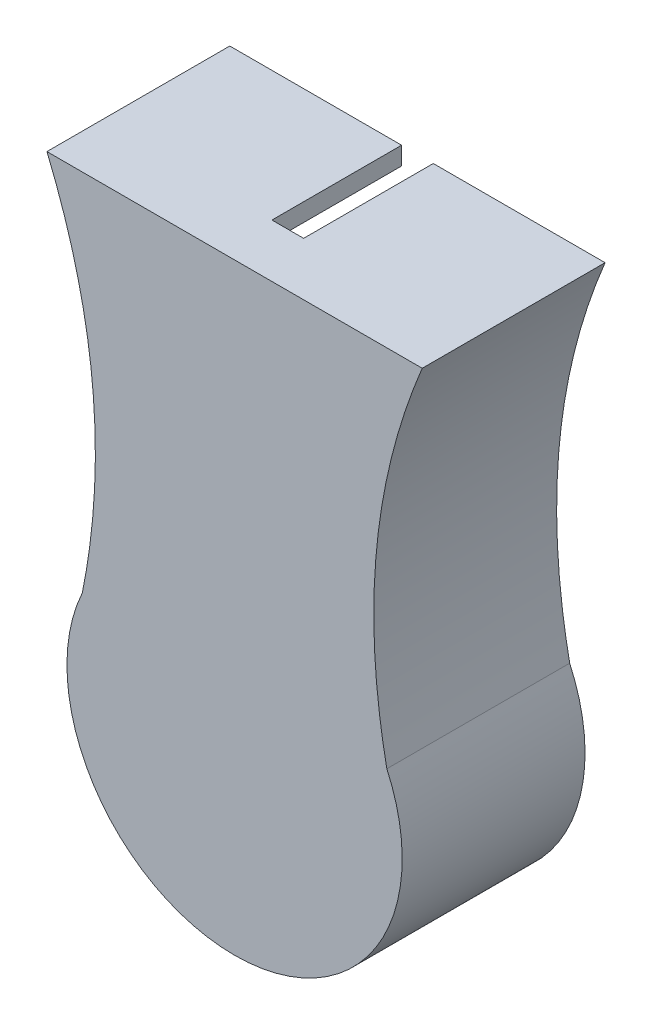
ISO-10303-21;
HEADER;
FILE_DESCRIPTION(('STEP AP214'),'2;1');
FILE_NAME('part.step','',(''),(''),'','','');
FILE_SCHEMA(('AUTOMOTIVE_DESIGN { 1 0 10303 214 1 1 1 1 }'));
ENDSEC;
DATA;
#1=APPLICATION_CONTEXT('core data for automotive mechanical design processes');
#2=APPLICATION_PROTOCOL_DEFINITION('international standard','automotive_design',2000,#1);
#3=PRODUCT_CONTEXT('',#1,'mechanical');
#4=PRODUCT('Part','Part','',(#3));
#5=PRODUCT_RELATED_PRODUCT_CATEGORY('part','',(#4));
#6=PRODUCT_DEFINITION_FORMATION('','',#4);
#7=PRODUCT_DEFINITION_CONTEXT('part definition',#1,'design');
#8=PRODUCT_DEFINITION('design','',#6,#7);
#9=PRODUCT_DEFINITION_SHAPE('','',#8);
#10=(LENGTH_UNIT() NAMED_UNIT(*) SI_UNIT(.MILLI.,.METRE.));
#11=(NAMED_UNIT(*) PLANE_ANGLE_UNIT() SI_UNIT($,.RADIAN.));
#12=(NAMED_UNIT(*) SI_UNIT($,.STERADIAN.) SOLID_ANGLE_UNIT());
#13=UNCERTAINTY_MEASURE_WITH_UNIT(LENGTH_MEASURE(1.E-05),#10,'distance_accuracy_value','');
#14=(GEOMETRIC_REPRESENTATION_CONTEXT(3) GLOBAL_UNCERTAINTY_ASSIGNED_CONTEXT((#13)) GLOBAL_UNIT_ASSIGNED_CONTEXT((#10,
#11,#12)) REPRESENTATION_CONTEXT('',''));
#15=CARTESIAN_POINT('',(0.,0.,0.));
#16=DIRECTION('',(0.,0.,1.));
#17=DIRECTION('',(1.,0.,0.));
#18=AXIS2_PLACEMENT_3D('',#15,#16,#17);
#19=CARTESIAN_POINT('',(30.7872849939756,71.3076466668099,30.));
#20=CARTESIAN_POINT('',(18.7115178403524,42.368167262495,30.));
#21=CARTESIAN_POINT('',(24.9829968324256,11.4934707234591,30.));
#22=B_SPLINE_CURVE_WITH_KNOTS('',2,(#19,#20,#21),.UNSPECIFIED.,.F.,.F.,(3,3),(0.,1.),.UNSPECIFIED.);
#23=DIRECTION('',(0.,0.,-1.));
#24=VECTOR('',#23,1.);
#25=SURFACE_OF_LINEAR_EXTRUSION('',#22,#24);
#26=CARTESIAN_POINT('',(30.7872849939756,71.3076466668099,0.));
#27=CARTESIAN_POINT('',(18.7115178403524,42.368167262495,0.));
#28=CARTESIAN_POINT('',(24.9829968324256,11.4934707234591,0.));
#29=B_SPLINE_CURVE_WITH_KNOTS('',2,(#26,#27,#28),.UNSPECIFIED.,.F.,.F.,(3,3),(0.,1.),.UNSPECIFIED.);
#30=CARTESIAN_POINT('',(30.7872849939756,71.3076466668099,0.));
#31=VERTEX_POINT('',#30);
#32=CARTESIAN_POINT('',(24.9829968324256,11.4934707234591,0.));
#33=VERTEX_POINT('',#32);
#34=EDGE_CURVE('E259',#31,#33,#29,.T.);
#35=ORIENTED_EDGE('',*,*,#34,.F.);
#36=DIRECTION('',(0.,0.,-1.));
#37=VECTOR('',#36,1.);
#38=CARTESIAN_POINT('',(30.7872849939756,71.3076466668099,30.));
#39=LINE('',#38,#37);
#40=CARTESIAN_POINT('',(30.7872849939756,71.3076466668099,30.));
#41=VERTEX_POINT('',#40);
#42=EDGE_CURVE('E12',#41,#31,#39,.T.);
#43=ORIENTED_EDGE('',*,*,#42,.F.);
#44=CARTESIAN_POINT('',(24.9829968324256,11.4934707234591,30.));
#45=VERTEX_POINT('',#44);
#46=EDGE_CURVE('E265',#41,#45,#22,.T.);
#47=ORIENTED_EDGE('',*,*,#46,.T.);
#48=DIRECTION('',(0.,0.,-1.));
#49=VECTOR('',#48,1.);
#50=CARTESIAN_POINT('',(24.9829968324256,11.4934707234591,30.));
#51=LINE('',#50,#49);
#52=EDGE_CURVE('E123',#45,#33,#51,.T.);
#53=ORIENTED_EDGE('',*,*,#52,.T.);
#54=EDGE_LOOP('',(#35,#43,#47,#53));
#55=FACE_BOUND('',#54,.T.);
#56=ADVANCED_FACE('F77',(#55),#25,.T.);
#57=CARTESIAN_POINT('',(0.,71.3076466668099,30.));
#58=DIRECTION('',(0.,1.,0.));
#59=DIRECTION('',(0.,0.,1.));
#60=AXIS2_PLACEMENT_3D('',#57,#58,#59);
#61=PLANE('',#60);
#62=DIRECTION('',(0.,0.,-1.));
#63=VECTOR('',#62,1.);
#64=CARTESIAN_POINT('',(-2.6,71.3076466668099,21.27));
#65=LINE('',#64,#63);
#66=CARTESIAN_POINT('',(-2.6,71.3076466668099,21.27));
#67=VERTEX_POINT('',#66);
#68=CARTESIAN_POINT('',(-2.6,71.3076466668099,0.));
#69=VERTEX_POINT('',#68);
#70=EDGE_CURVE('E251',#67,#69,#65,.T.);
#71=ORIENTED_EDGE('',*,*,#70,.T.);
#72=DIRECTION('',(1.,0.,0.));
#73=VECTOR('',#72,1.);
#74=CARTESIAN_POINT('',(0.,71.3076466668099,0.));
#75=LINE('',#74,#73);
#76=CARTESIAN_POINT('',(-30.7872849939756,71.3076466668099,0.));
#77=VERTEX_POINT('',#76);
#78=EDGE_CURVE('E304',#77,#69,#75,.T.);
#79=ORIENTED_EDGE('',*,*,#78,.F.);
#80=DIRECTION('',(0.,0.,-1.));
#81=VECTOR('',#80,1.);
#82=CARTESIAN_POINT('',(-30.7872849939756,71.3076466668099,30.));
#83=LINE('',#82,#81);
#84=CARTESIAN_POINT('',(-30.7872849939756,71.3076466668099,30.));
#85=VERTEX_POINT('',#84);
#86=EDGE_CURVE('E86',#85,#77,#83,.T.);
#87=ORIENTED_EDGE('',*,*,#86,.F.);
#88=DIRECTION('',(1.,0.,0.));
#89=VECTOR('',#88,1.);
#90=CARTESIAN_POINT('',(0.,71.3076466668099,30.));
#91=LINE('',#90,#89);
#92=EDGE_CURVE('E271',#85,#41,#91,.T.);
#93=ORIENTED_EDGE('',*,*,#92,.T.);
#94=ORIENTED_EDGE('',*,*,#42,.T.);
#95=CARTESIAN_POINT('',(2.6,71.3076466668099,0.));
#96=VERTEX_POINT('',#95);
#97=EDGE_CURVE('E316',#96,#31,#75,.T.);
#98=ORIENTED_EDGE('',*,*,#97,.F.);
#99=DIRECTION('',(0.,0.,-1.));
#100=VECTOR('',#99,1.);
#101=CARTESIAN_POINT('',(2.6,71.3076466668099,21.27));
#102=LINE('',#101,#100);
#103=CARTESIAN_POINT('',(2.6,71.3076466668099,21.27));
#104=VERTEX_POINT('',#103);
#105=EDGE_CURVE('E93',#104,#96,#102,.T.);
#106=ORIENTED_EDGE('',*,*,#105,.F.);
#107=DIRECTION('',(-1.,0.,0.));
#108=VECTOR('',#107,1.);
#109=CARTESIAN_POINT('',(2.6,71.3076466668099,21.27));
#110=LINE('',#109,#108);
#111=EDGE_CURVE('E243',#104,#67,#110,.T.);
#112=ORIENTED_EDGE('',*,*,#111,.T.);
#113=EDGE_LOOP('',(#71,#79,#87,#93,#94,#98,#106,#112));
#114=FACE_BOUND('',#113,.T.);
#115=ADVANCED_FACE('F294',(#114),#61,.T.);
#116=CARTESIAN_POINT('',(-30.7872849939756,71.3076466668099,30.));
#117=CARTESIAN_POINT('',(-18.7115178403524,42.368167262495,30.));
#118=CARTESIAN_POINT('',(-24.9829968324256,11.4934707234591,30.));
#119=B_SPLINE_CURVE_WITH_KNOTS('',2,(#116,#117,#118),.UNSPECIFIED.,.F.,.F.,(3,3),(0.,1.),.UNSPECIFIED.);
#120=DIRECTION('',(0.,0.,-1.));
#121=VECTOR('',#120,1.);
#122=SURFACE_OF_LINEAR_EXTRUSION('',#119,#121);
#123=CARTESIAN_POINT('',(-30.7872849939756,71.3076466668099,0.));
#124=CARTESIAN_POINT('',(-18.7115178403524,42.368167262495,0.));
#125=CARTESIAN_POINT('',(-24.9829968324256,11.4934707234591,0.));
#126=B_SPLINE_CURVE_WITH_KNOTS('',2,(#123,#124,#125),.UNSPECIFIED.,.F.,.F.,(3,3),(0.,1.),.UNSPECIFIED.);
#127=CARTESIAN_POINT('',(-24.9829968324256,11.4934707234591,0.));
#128=VERTEX_POINT('',#127);
#129=EDGE_CURVE('E314',#77,#128,#126,.T.);
#130=ORIENTED_EDGE('',*,*,#129,.T.);
#131=DIRECTION('',(0.,0.,-1.));
#132=VECTOR('',#131,1.);
#133=CARTESIAN_POINT('',(-24.9829968324256,11.4934707234591,30.));
#134=LINE('',#133,#132);
#135=CARTESIAN_POINT('',(-24.9829968324256,11.4934707234591,30.));
#136=VERTEX_POINT('',#135);
#137=EDGE_CURVE('E333',#136,#128,#134,.T.);
#138=ORIENTED_EDGE('',*,*,#137,.F.);
#139=EDGE_CURVE('E279',#85,#136,#119,.T.);
#140=ORIENTED_EDGE('',*,*,#139,.F.);
#141=ORIENTED_EDGE('',*,*,#86,.T.);
#142=EDGE_LOOP('',(#130,#138,#140,#141));
#143=FACE_BOUND('',#142,.T.);
#144=ADVANCED_FACE('F290',(#143),#122,.F.);
#145=CARTESIAN_POINT('',(0.,0.,30.));
#146=DIRECTION('',(0.,0.,-1.));
#147=DIRECTION('',(-1.,0.,0.));
#148=AXIS2_PLACEMENT_3D('',#145,#146,#147);
#149=CYLINDRICAL_SURFACE('',#148,27.5);
#150=CARTESIAN_POINT('',(0.,0.,0.));
#151=DIRECTION('',(0.,0.,1.));
#152=DIRECTION('',(1.,0.,0.));
#153=AXIS2_PLACEMENT_3D('',#150,#151,#152);
#154=CIRCLE('',#153,27.5);
#155=EDGE_CURVE('E272',#128,#33,#154,.T.);
#156=ORIENTED_EDGE('',*,*,#155,.T.);
#157=ORIENTED_EDGE('',*,*,#52,.F.);
#158=CARTESIAN_POINT('',(0.,0.,30.));
#159=DIRECTION('',(0.,0.,1.));
#160=DIRECTION('',(1.,0.,0.));
#161=AXIS2_PLACEMENT_3D('',#158,#159,#160);
#162=CIRCLE('',#161,27.5);
#163=EDGE_CURVE('E102',#136,#45,#162,.T.);
#164=ORIENTED_EDGE('',*,*,#163,.F.);
#165=ORIENTED_EDGE('',*,*,#137,.T.);
#166=EDGE_LOOP('',(#156,#157,#164,#165));
#167=FACE_BOUND('',#166,.T.);
#168=ADVANCED_FACE('F293',(#167),#149,.T.);
#169=CARTESIAN_POINT('',(0.,0.,30.));
#170=DIRECTION('',(0.,0.,1.));
#171=DIRECTION('',(1.,0.,0.));
#172=AXIS2_PLACEMENT_3D('',#169,#170,#171);
#173=PLANE('',#172);
#174=ORIENTED_EDGE('',*,*,#46,.F.);
#175=ORIENTED_EDGE('',*,*,#92,.F.);
#176=ORIENTED_EDGE('',*,*,#139,.T.);
#177=ORIENTED_EDGE('',*,*,#163,.T.);
#178=EDGE_LOOP('',(#174,#175,#176,#177));
#179=FACE_BOUND('',#178,.T.);
#180=ADVANCED_FACE('F341',(#179),#173,.T.);
#181=CARTESIAN_POINT('',(0.,0.,0.));
#182=DIRECTION('',(0.,0.,1.));
#183=DIRECTION('',(1.,0.,0.));
#184=AXIS2_PLACEMENT_3D('',#181,#182,#183);
#185=PLANE('',#184);
#186=ORIENTED_EDGE('',*,*,#78,.T.);
#187=DIRECTION('',(0.,1.,0.));
#188=VECTOR('',#187,1.);
#189=CARTESIAN_POINT('',(-2.6,68.35,0.));
#190=LINE('',#189,#188);
#191=CARTESIAN_POINT('',(-2.6,68.35,0.));
#192=VERTEX_POINT('',#191);
#193=EDGE_CURVE('E252',#192,#69,#190,.T.);
#194=ORIENTED_EDGE('',*,*,#193,.F.);
#195=DIRECTION('',(-1.,0.,0.));
#196=VECTOR('',#195,1.);
#197=CARTESIAN_POINT('',(0.,68.35,0.));
#198=LINE('',#197,#196);
#199=CARTESIAN_POINT('',(-11.6,68.35,0.));
#200=VERTEX_POINT('',#199);
#201=EDGE_CURVE('E373',#192,#200,#198,.T.);
#202=ORIENTED_EDGE('',*,*,#201,.T.);
#203=DIRECTION('',(0.,1.,0.));
#204=VECTOR('',#203,1.);
#205=CARTESIAN_POINT('',(-11.6,0.,0.));
#206=LINE('',#205,#204);
#207=CARTESIAN_POINT('',(-11.6,66.25,0.));
#208=VERTEX_POINT('',#207);
#209=EDGE_CURVE('E376',#208,#200,#206,.T.);
#210=ORIENTED_EDGE('',*,*,#209,.F.);
#211=DIRECTION('',(-1.,0.,0.));
#212=VECTOR('',#211,1.);
#213=CARTESIAN_POINT('',(0.,66.25,0.));
#214=LINE('',#213,#212);
#215=CARTESIAN_POINT('',(-21.25,66.25,0.));
#216=VERTEX_POINT('',#215);
#217=EDGE_CURVE('E370',#208,#216,#214,.T.);
#218=ORIENTED_EDGE('',*,*,#217,.T.);
#219=DIRECTION('',(0.,-1.,0.));
#220=VECTOR('',#219,1.);
#221=CARTESIAN_POINT('',(-21.25,0.,0.));
#222=LINE('',#221,#220);
#223=CARTESIAN_POINT('',(-21.25,23.75,0.));
#224=VERTEX_POINT('',#223);
#225=EDGE_CURVE('E380',#216,#224,#222,.T.);
#226=ORIENTED_EDGE('',*,*,#225,.T.);
#227=DIRECTION('',(-1.,0.,0.));
#228=VECTOR('',#227,1.);
#229=CARTESIAN_POINT('',(0.,23.75,0.));
#230=LINE('',#229,#228);
#231=CARTESIAN_POINT('',(21.25,23.75,0.));
#232=VERTEX_POINT('',#231);
#233=EDGE_CURVE('E384',#232,#224,#230,.T.);
#234=ORIENTED_EDGE('',*,*,#233,.F.);
#235=DIRECTION('',(0.,-1.,0.));
#236=VECTOR('',#235,1.);
#237=CARTESIAN_POINT('',(21.25,0.,0.));
#238=LINE('',#237,#236);
#239=CARTESIAN_POINT('',(21.25,66.25,0.));
#240=VERTEX_POINT('',#239);
#241=EDGE_CURVE('E221',#240,#232,#238,.T.);
#242=ORIENTED_EDGE('',*,*,#241,.F.);
#243=CARTESIAN_POINT('',(11.6,66.25,0.));
#244=VERTEX_POINT('',#243);
#245=EDGE_CURVE('E262',#240,#244,#214,.T.);
#246=ORIENTED_EDGE('',*,*,#245,.T.);
#247=DIRECTION('',(0.,1.,0.));
#248=VECTOR('',#247,1.);
#249=CARTESIAN_POINT('',(11.6,0.,0.));
#250=LINE('',#249,#248);
#251=CARTESIAN_POINT('',(11.6,68.35,0.));
#252=VERTEX_POINT('',#251);
#253=EDGE_CURVE('E226',#244,#252,#250,.T.);
#254=ORIENTED_EDGE('',*,*,#253,.T.);
#255=CARTESIAN_POINT('',(2.6,68.35,0.));
#256=VERTEX_POINT('',#255);
#257=EDGE_CURVE('E346',#252,#256,#198,.T.);
#258=ORIENTED_EDGE('',*,*,#257,.T.);
#259=DIRECTION('',(0.,1.,0.));
#260=VECTOR('',#259,1.);
#261=CARTESIAN_POINT('',(2.6,68.35,0.));
#262=LINE('',#261,#260);
#263=EDGE_CURVE('E244',#256,#96,#262,.T.);
#264=ORIENTED_EDGE('',*,*,#263,.T.);
#265=ORIENTED_EDGE('',*,*,#97,.T.);
#266=ORIENTED_EDGE('',*,*,#34,.T.);
#267=ORIENTED_EDGE('',*,*,#155,.F.);
#268=ORIENTED_EDGE('',*,*,#129,.F.);
#269=EDGE_LOOP('',(#186,#194,#202,#210,#218,#226,#234,#242,#246,#254,#258,#264,#265,#266,#267,#268));
#270=FACE_BOUND('',#269,.T.);
#271=ADVANCED_FACE('F311',(#270),#185,.F.);
#272=CARTESIAN_POINT('',(21.25,0.,21.27));
#273=DIRECTION('',(1.,0.,0.));
#274=DIRECTION('',(0.,1.,0.));
#275=AXIS2_PLACEMENT_3D('',#272,#273,#274);
#276=PLANE('',#275);
#277=ORIENTED_EDGE('',*,*,#241,.T.);
#278=DIRECTION('',(0.,0.,-1.));
#279=VECTOR('',#278,1.);
#280=CARTESIAN_POINT('',(21.25,23.75,21.27));
#281=LINE('',#280,#279);
#282=CARTESIAN_POINT('',(21.25,23.75,21.27));
#283=VERTEX_POINT('',#282);
#284=EDGE_CURVE('E393',#283,#232,#281,.T.);
#285=ORIENTED_EDGE('',*,*,#284,.F.);
#286=DIRECTION('',(0.,-1.,0.));
#287=VECTOR('',#286,1.);
#288=CARTESIAN_POINT('',(21.25,0.,21.27));
#289=LINE('',#288,#287);
#290=CARTESIAN_POINT('',(21.25,66.25,21.27));
#291=VERTEX_POINT('',#290);
#292=EDGE_CURVE('E365',#291,#283,#289,.T.);
#293=ORIENTED_EDGE('',*,*,#292,.F.);
#294=DIRECTION('',(0.,0.,-1.));
#295=VECTOR('',#294,1.);
#296=CARTESIAN_POINT('',(21.25,66.25,21.27));
#297=LINE('',#296,#295);
#298=EDGE_CURVE('E219',#291,#240,#297,.T.);
#299=ORIENTED_EDGE('',*,*,#298,.T.);
#300=EDGE_LOOP('',(#277,#285,#293,#299));
#301=FACE_BOUND('',#300,.T.);
#302=ADVANCED_FACE('F433',(#301),#276,.F.);
#303=CARTESIAN_POINT('',(0.,23.75,21.27));
#304=DIRECTION('',(0.,-1.,0.));
#305=DIRECTION('',(1.,0.,0.));
#306=AXIS2_PLACEMENT_3D('',#303,#304,#305);
#307=PLANE('',#306);
#308=ORIENTED_EDGE('',*,*,#233,.T.);
#309=DIRECTION('',(0.,0.,-1.));
#310=VECTOR('',#309,1.);
#311=CARTESIAN_POINT('',(-21.25,23.75,21.27));
#312=LINE('',#311,#310);
#313=CARTESIAN_POINT('',(-21.25,23.75,21.27));
#314=VERTEX_POINT('',#313);
#315=EDGE_CURVE('E396',#314,#224,#312,.T.);
#316=ORIENTED_EDGE('',*,*,#315,.F.);
#317=DIRECTION('',(-1.,0.,0.));
#318=VECTOR('',#317,1.);
#319=CARTESIAN_POINT('',(0.,23.75,21.27));
#320=LINE('',#319,#318);
#321=EDGE_CURVE('E361',#283,#314,#320,.T.);
#322=ORIENTED_EDGE('',*,*,#321,.F.);
#323=ORIENTED_EDGE('',*,*,#284,.T.);
#324=EDGE_LOOP('',(#308,#316,#322,#323));
#325=FACE_BOUND('',#324,.T.);
#326=ADVANCED_FACE('F430',(#325),#307,.F.);
#327=CARTESIAN_POINT('',(-21.25,0.,21.27));
#328=DIRECTION('',(1.,0.,0.));
#329=DIRECTION('',(0.,1.,0.));
#330=AXIS2_PLACEMENT_3D('',#327,#328,#329);
#331=PLANE('',#330);
#332=ORIENTED_EDGE('',*,*,#225,.F.);
#333=DIRECTION('',(0.,0.,-1.));
#334=VECTOR('',#333,1.);
#335=CARTESIAN_POINT('',(-21.25,66.25,21.27));
#336=LINE('',#335,#334);
#337=CARTESIAN_POINT('',(-21.25,66.25,21.27));
#338=VERTEX_POINT('',#337);
#339=EDGE_CURVE('E399',#338,#216,#336,.T.);
#340=ORIENTED_EDGE('',*,*,#339,.F.);
#341=DIRECTION('',(0.,-1.,0.));
#342=VECTOR('',#341,1.);
#343=CARTESIAN_POINT('',(-21.25,0.,21.27));
#344=LINE('',#343,#342);
#345=EDGE_CURVE('E358',#338,#314,#344,.T.);
#346=ORIENTED_EDGE('',*,*,#345,.T.);
#347=ORIENTED_EDGE('',*,*,#315,.T.);
#348=EDGE_LOOP('',(#332,#340,#346,#347));
#349=FACE_BOUND('',#348,.T.);
#350=ADVANCED_FACE('F426',(#349),#331,.T.);
#351=CARTESIAN_POINT('',(0.,66.25,21.27));
#352=DIRECTION('',(0.,-1.,0.));
#353=DIRECTION('',(1.,0.,0.));
#354=AXIS2_PLACEMENT_3D('',#351,#352,#353);
#355=PLANE('',#354);
#356=ORIENTED_EDGE('',*,*,#217,.F.);
#357=DIRECTION('',(0.,0.,-1.));
#358=VECTOR('',#357,1.);
#359=CARTESIAN_POINT('',(-11.6,66.25,21.27));
#360=LINE('',#359,#358);
#361=CARTESIAN_POINT('',(-11.6,66.25,21.27));
#362=VERTEX_POINT('',#361);
#363=EDGE_CURVE('E402',#362,#208,#360,.T.);
#364=ORIENTED_EDGE('',*,*,#363,.F.);
#365=DIRECTION('',(-1.,0.,0.));
#366=VECTOR('',#365,1.);
#367=CARTESIAN_POINT('',(0.,66.25,21.27));
#368=LINE('',#367,#366);
#369=EDGE_CURVE('E223',#362,#338,#368,.T.);
#370=ORIENTED_EDGE('',*,*,#369,.T.);
#371=ORIENTED_EDGE('',*,*,#339,.T.);
#372=EDGE_LOOP('',(#356,#364,#370,#371));
#373=FACE_BOUND('',#372,.T.);
#374=ADVANCED_FACE('F421',(#373),#355,.T.);
#375=ORIENTED_EDGE('',*,*,#245,.F.);
#376=ORIENTED_EDGE('',*,*,#298,.F.);
#377=CARTESIAN_POINT('',(11.6,66.25,21.27));
#378=VERTEX_POINT('',#377);
#379=EDGE_CURVE('E202',#291,#378,#368,.T.);
#380=ORIENTED_EDGE('',*,*,#379,.T.);
#381=DIRECTION('',(0.,0.,-1.));
#382=VECTOR('',#381,1.);
#383=CARTESIAN_POINT('',(11.6,66.25,21.27));
#384=LINE('',#383,#382);
#385=EDGE_CURVE('E217',#378,#244,#384,.T.);
#386=ORIENTED_EDGE('',*,*,#385,.T.);
#387=EDGE_LOOP('',(#375,#376,#380,#386));
#388=FACE_BOUND('',#387,.T.);
#389=ADVANCED_FACE('F216',(#388),#355,.T.);
#390=CARTESIAN_POINT('',(11.6,0.,21.27));
#391=DIRECTION('',(-1.,0.,0.));
#392=DIRECTION('',(0.,0.,1.));
#393=AXIS2_PLACEMENT_3D('',#390,#391,#392);
#394=PLANE('',#393);
#395=ORIENTED_EDGE('',*,*,#253,.F.);
#396=ORIENTED_EDGE('',*,*,#385,.F.);
#397=DIRECTION('',(0.,1.,0.));
#398=VECTOR('',#397,1.);
#399=CARTESIAN_POINT('',(11.6,0.,21.27));
#400=LINE('',#399,#398);
#401=CARTESIAN_POINT('',(11.6,68.35,21.27));
#402=VERTEX_POINT('',#401);
#403=EDGE_CURVE('E198',#378,#402,#400,.T.);
#404=ORIENTED_EDGE('',*,*,#403,.T.);
#405=DIRECTION('',(0.,0.,-1.));
#406=VECTOR('',#405,1.);
#407=CARTESIAN_POINT('',(11.6,68.35,21.27));
#408=LINE('',#407,#406);
#409=EDGE_CURVE('E229',#402,#252,#408,.T.);
#410=ORIENTED_EDGE('',*,*,#409,.T.);
#411=EDGE_LOOP('',(#395,#396,#404,#410));
#412=FACE_BOUND('',#411,.T.);
#413=ADVANCED_FACE('F224',(#412),#394,.T.);
#414=CARTESIAN_POINT('',(-11.6,0.,21.27));
#415=DIRECTION('',(-1.,0.,0.));
#416=DIRECTION('',(0.,0.,1.));
#417=AXIS2_PLACEMENT_3D('',#414,#415,#416);
#418=PLANE('',#417);
#419=ORIENTED_EDGE('',*,*,#209,.T.);
#420=DIRECTION('',(0.,0.,-1.));
#421=VECTOR('',#420,1.);
#422=CARTESIAN_POINT('',(-11.6,68.35,21.27));
#423=LINE('',#422,#421);
#424=CARTESIAN_POINT('',(-11.6,68.35,21.27));
#425=VERTEX_POINT('',#424);
#426=EDGE_CURVE('E235',#425,#200,#423,.T.);
#427=ORIENTED_EDGE('',*,*,#426,.F.);
#428=DIRECTION('',(0.,1.,0.));
#429=VECTOR('',#428,1.);
#430=CARTESIAN_POINT('',(-11.6,0.,21.27));
#431=LINE('',#430,#429);
#432=EDGE_CURVE('E351',#362,#425,#431,.T.);
#433=ORIENTED_EDGE('',*,*,#432,.F.);
#434=ORIENTED_EDGE('',*,*,#363,.T.);
#435=EDGE_LOOP('',(#419,#427,#433,#434));
#436=FACE_BOUND('',#435,.T.);
#437=ADVANCED_FACE('F413',(#436),#418,.F.);
#438=CARTESIAN_POINT('',(0.,0.,21.27));
#439=DIRECTION('',(0.,0.,1.));
#440=DIRECTION('',(1.,0.,0.));
#441=AXIS2_PLACEMENT_3D('',#438,#439,#440);
#442=PLANE('',#441);
#443=ORIENTED_EDGE('',*,*,#379,.F.);
#444=ORIENTED_EDGE('',*,*,#292,.T.);
#445=ORIENTED_EDGE('',*,*,#321,.T.);
#446=ORIENTED_EDGE('',*,*,#345,.F.);
#447=ORIENTED_EDGE('',*,*,#369,.F.);
#448=ORIENTED_EDGE('',*,*,#432,.T.);
#449=DIRECTION('',(-1.,0.,0.));
#450=VECTOR('',#449,1.);
#451=CARTESIAN_POINT('',(0.,68.35,21.27));
#452=LINE('',#451,#450);
#453=CARTESIAN_POINT('',(-2.6,68.35,21.27));
#454=VERTEX_POINT('',#453);
#455=EDGE_CURVE('E211',#454,#425,#452,.T.);
#456=ORIENTED_EDGE('',*,*,#455,.F.);
#457=DIRECTION('',(0.,1.,0.));
#458=VECTOR('',#457,1.);
#459=CARTESIAN_POINT('',(-2.6,68.35,21.27));
#460=LINE('',#459,#458);
#461=EDGE_CURVE('E239',#454,#67,#460,.T.);
#462=ORIENTED_EDGE('',*,*,#461,.T.);
#463=ORIENTED_EDGE('',*,*,#111,.F.);
#464=DIRECTION('',(0.,1.,0.));
#465=VECTOR('',#464,1.);
#466=CARTESIAN_POINT('',(2.6,68.35,21.27));
#467=LINE('',#466,#465);
#468=CARTESIAN_POINT('',(2.6,68.35,21.27));
#469=VERTEX_POINT('',#468);
#470=EDGE_CURVE('E248',#469,#104,#467,.T.);
#471=ORIENTED_EDGE('',*,*,#470,.F.);
#472=EDGE_CURVE('E206',#402,#469,#452,.T.);
#473=ORIENTED_EDGE('',*,*,#472,.F.);
#474=ORIENTED_EDGE('',*,*,#403,.F.);
#475=EDGE_LOOP('',(#443,#444,#445,#446,#447,#448,#456,#462,#463,#471,#473,#474));
#476=FACE_BOUND('',#475,.T.);
#477=ADVANCED_FACE('F200',(#476),#442,.F.);
#478=CARTESIAN_POINT('',(0.,68.35,21.27));
#479=DIRECTION('',(0.,-1.,0.));
#480=DIRECTION('',(0.,0.,-1.));
#481=AXIS2_PLACEMENT_3D('',#478,#479,#480);
#482=PLANE('',#481);
#483=ORIENTED_EDGE('',*,*,#455,.T.);
#484=ORIENTED_EDGE('',*,*,#426,.T.);
#485=ORIENTED_EDGE('',*,*,#201,.F.);
#486=DIRECTION('',(0.,0.,-1.));
#487=VECTOR('',#486,1.);
#488=CARTESIAN_POINT('',(-2.6,68.35,21.27));
#489=LINE('',#488,#487);
#490=EDGE_CURVE('E228',#454,#192,#489,.T.);
#491=ORIENTED_EDGE('',*,*,#490,.F.);
#492=EDGE_LOOP('',(#483,#484,#485,#491));
#493=FACE_BOUND('',#492,.T.);
#494=ADVANCED_FACE('F408',(#493),#482,.T.);
#495=DIRECTION('',(0.,0.,-1.));
#496=VECTOR('',#495,1.);
#497=CARTESIAN_POINT('',(2.6,68.35,21.27));
#498=LINE('',#497,#496);
#499=EDGE_CURVE('E233',#469,#256,#498,.T.);
#500=ORIENTED_EDGE('',*,*,#499,.T.);
#501=ORIENTED_EDGE('',*,*,#257,.F.);
#502=ORIENTED_EDGE('',*,*,#409,.F.);
#503=ORIENTED_EDGE('',*,*,#472,.T.);
#504=EDGE_LOOP('',(#500,#501,#502,#503));
#505=FACE_BOUND('',#504,.T.);
#506=ADVANCED_FACE('F349',(#505),#482,.T.);
#507=CARTESIAN_POINT('',(-2.6,68.35,21.27));
#508=DIRECTION('',(-1.,0.,0.));
#509=DIRECTION('',(0.,-1.,0.));
#510=AXIS2_PLACEMENT_3D('',#507,#508,#509);
#511=PLANE('',#510);
#512=ORIENTED_EDGE('',*,*,#193,.T.);
#513=ORIENTED_EDGE('',*,*,#70,.F.);
#514=ORIENTED_EDGE('',*,*,#461,.F.);
#515=ORIENTED_EDGE('',*,*,#490,.T.);
#516=EDGE_LOOP('',(#512,#513,#514,#515));
#517=FACE_BOUND('',#516,.T.);
#518=ADVANCED_FACE('F435',(#517),#511,.F.);
#519=CARTESIAN_POINT('',(2.6,68.35,21.27));
#520=DIRECTION('',(-1.,0.,0.));
#521=DIRECTION('',(0.,-1.,0.));
#522=AXIS2_PLACEMENT_3D('',#519,#520,#521);
#523=PLANE('',#522);
#524=ORIENTED_EDGE('',*,*,#263,.F.);
#525=ORIENTED_EDGE('',*,*,#499,.F.);
#526=ORIENTED_EDGE('',*,*,#470,.T.);
#527=ORIENTED_EDGE('',*,*,#105,.T.);
#528=EDGE_LOOP('',(#524,#525,#526,#527));
#529=FACE_BOUND('',#528,.T.);
#530=ADVANCED_FACE('F347',(#529),#523,.T.);
#531=CLOSED_SHELL('',(#56,#115,#144,#168,#180,#271,#302,#326,#350,#374,#389,#413,#437,#477,#494,
#506,#518,#530));
#532=MANIFOLD_SOLID_BREP('B2',#531);
#533=ADVANCED_BREP_SHAPE_REPRESENTATION('',(#18,#532),#14);
#534=SHAPE_DEFINITION_REPRESENTATION(#9,#533);
ENDSEC;
END-ISO-10303-21;
